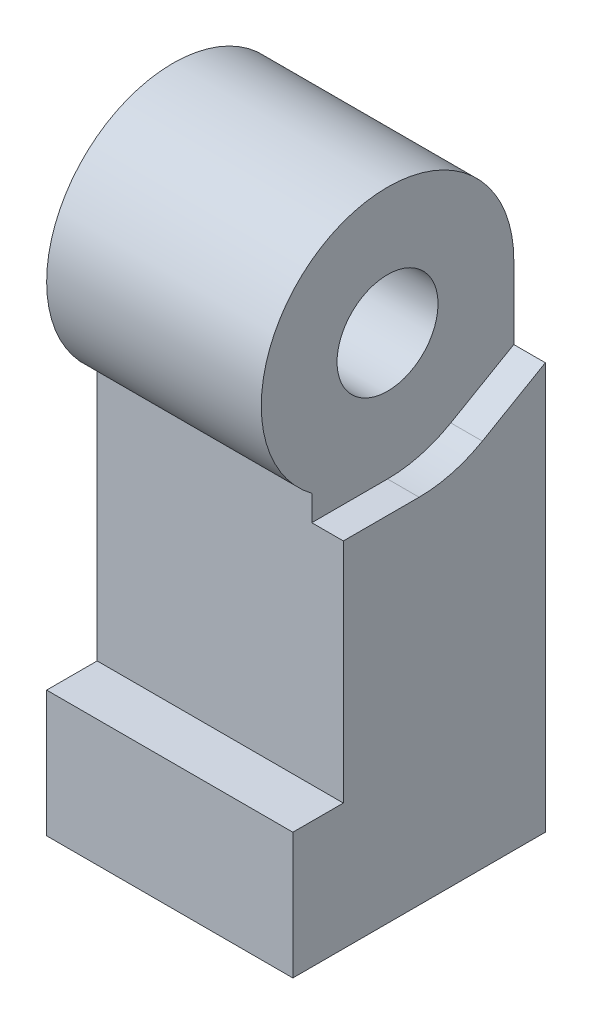
ISO-10303-21;
HEADER;
FILE_DESCRIPTION(('STEP AP214'),'2;1');
FILE_NAME('part.step','',(''),(''),'','','');
FILE_SCHEMA(('AUTOMOTIVE_DESIGN { 1 0 10303 214 1 1 1 1 }'));
ENDSEC;
DATA;
#1=APPLICATION_CONTEXT('core data for automotive mechanical design processes');
#2=APPLICATION_PROTOCOL_DEFINITION('international standard','automotive_design',2000,#1);
#3=PRODUCT_CONTEXT('',#1,'mechanical');
#4=PRODUCT('Part','Part','',(#3));
#5=PRODUCT_RELATED_PRODUCT_CATEGORY('part','',(#4));
#6=PRODUCT_DEFINITION_FORMATION('','',#4);
#7=PRODUCT_DEFINITION_CONTEXT('part definition',#1,'design');
#8=PRODUCT_DEFINITION('design','',#6,#7);
#9=PRODUCT_DEFINITION_SHAPE('','',#8);
#10=(LENGTH_UNIT() NAMED_UNIT(*) SI_UNIT(.MILLI.,.METRE.));
#11=(NAMED_UNIT(*) PLANE_ANGLE_UNIT() SI_UNIT($,.RADIAN.));
#12=(NAMED_UNIT(*) SI_UNIT($,.STERADIAN.) SOLID_ANGLE_UNIT());
#13=UNCERTAINTY_MEASURE_WITH_UNIT(LENGTH_MEASURE(1.E-05),#10,'distance_accuracy_value','');
#14=(GEOMETRIC_REPRESENTATION_CONTEXT(3) GLOBAL_UNCERTAINTY_ASSIGNED_CONTEXT((#13)) GLOBAL_UNIT_ASSIGNED_CONTEXT((#10,
#11,#12)) REPRESENTATION_CONTEXT('',''));
#15=CARTESIAN_POINT('',(0.,0.,0.));
#16=DIRECTION('',(0.,0.,1.));
#17=DIRECTION('',(1.,0.,0.));
#18=AXIS2_PLACEMENT_3D('',#15,#16,#17);
#19=CARTESIAN_POINT('',(43.6847577830937,26.5038495513632,5.52238927686668));
#20=DIRECTION('',(-1.,0.,0.));
#21=DIRECTION('',(0.,0.,1.));
#22=AXIS2_PLACEMENT_3D('',#19,#20,#21);
#23=CYLINDRICAL_SURFACE('',#22,10.);
#24=CARTESIAN_POINT('',(12.4004865356318,26.5038495513632,5.52238927686668));
#25=DIRECTION('',(1.,0.,0.));
#26=DIRECTION('',(0.,0.,-1.));
#27=AXIS2_PLACEMENT_3D('',#24,#25,#26);
#28=CIRCLE('',#27,10.);
#29=CARTESIAN_POINT('',(12.4004865356318,26.5038495513632,-4.47761072313332));
#30=VERTEX_POINT('',#29);
#31=CARTESIAN_POINT('',(12.4004865356318,18.5038495513632,11.5223892768667));
#32=VERTEX_POINT('',#31);
#33=EDGE_CURVE('E44',#30,#32,#28,.T.);
#34=ORIENTED_EDGE('',*,*,#33,.F.);
#35=DIRECTION('',(-1.,0.,0.));
#36=VECTOR('',#35,1.);
#37=CARTESIAN_POINT('',(-4.59951346436824,26.5038495513632,-4.47761072313333));
#38=LINE('',#37,#36);
#39=CARTESIAN_POINT('',(-4.59951346436824,26.5038495513632,-4.47761072313333));
#40=VERTEX_POINT('',#39);
#41=EDGE_CURVE('E187',#30,#40,#38,.T.);
#42=ORIENTED_EDGE('',*,*,#41,.T.);
#43=CARTESIAN_POINT('',(-4.59951346436824,26.5038495513632,5.52238927686668));
#44=DIRECTION('',(1.,0.,0.));
#45=DIRECTION('',(0.,0.,-1.));
#46=AXIS2_PLACEMENT_3D('',#43,#44,#45);
#47=CIRCLE('',#46,10.);
#48=CARTESIAN_POINT('',(-4.59951346436823,18.5038495513632,11.5223892768667));
#49=VERTEX_POINT('',#48);
#50=EDGE_CURVE('E216',#40,#49,#47,.T.);
#51=ORIENTED_EDGE('',*,*,#50,.T.);
#52=DIRECTION('',(-1.,0.,0.));
#53=VECTOR('',#52,1.);
#54=CARTESIAN_POINT('',(43.6847577830937,18.5038495513632,11.5223892768667));
#55=LINE('',#54,#53);
#56=EDGE_CURVE('E208',#49,#32,#55,.F.);
#57=ORIENTED_EDGE('',*,*,#56,.T.);
#58=EDGE_LOOP('',(#34,#42,#51,#57));
#59=FACE_BOUND('',#58,.T.);
#60=ADVANCED_FACE('F36',(#59),#23,.T.);
#61=CARTESIAN_POINT('',(-4.59951346436823,26.5038495513632,11.5223892768667));
#62=DIRECTION('',(0.,0.,-1.));
#63=DIRECTION('',(-1.,0.,0.));
#64=AXIS2_PLACEMENT_3D('',#61,#62,#63);
#65=PLANE('',#64);
#66=DIRECTION('',(1.,0.,0.));
#67=VECTOR('',#66,1.);
#68=CARTESIAN_POINT('',(-4.59951346436823,-1.49615044863682,11.5223892768667));
#69=LINE('',#68,#67);
#70=CARTESIAN_POINT('',(-4.59951346436824,-1.49615044863682,11.5223892768667));
#71=VERTEX_POINT('',#70);
#72=CARTESIAN_POINT('',(14.9004865356318,-1.49615044863682,11.5223892768667));
#73=VERTEX_POINT('',#72);
#74=EDGE_CURVE('E177',#71,#73,#69,.T.);
#75=ORIENTED_EDGE('',*,*,#74,.T.);
#76=DIRECTION('',(0.,1.,0.));
#77=VECTOR('',#76,1.);
#78=CARTESIAN_POINT('',(14.9004865356318,26.5038495513632,11.5223892768667));
#79=LINE('',#78,#77);
#80=CARTESIAN_POINT('',(14.9004865356318,16.4838495513632,11.5223892768667));
#81=VERTEX_POINT('',#80);
#82=EDGE_CURVE('E286',#73,#81,#79,.T.);
#83=ORIENTED_EDGE('',*,*,#82,.T.);
#84=DIRECTION('',(-1.,0.,0.));
#85=VECTOR('',#84,1.);
#86=CARTESIAN_POINT('',(-4.59951346436823,16.4838495513632,11.5223892768667));
#87=LINE('',#86,#85);
#88=CARTESIAN_POINT('',(12.4004865356318,16.4838495513632,11.5223892768667));
#89=VERTEX_POINT('',#88);
#90=EDGE_CURVE('E211',#81,#89,#87,.T.);
#91=ORIENTED_EDGE('',*,*,#90,.T.);
#92=DIRECTION('',(0.,-1.,0.));
#93=VECTOR('',#92,1.);
#94=CARTESIAN_POINT('',(12.4004865356318,26.5038495513632,11.5223892768667));
#95=LINE('',#94,#93);
#96=EDGE_CURVE('E199',#32,#89,#95,.T.);
#97=ORIENTED_EDGE('',*,*,#96,.F.);
#98=ORIENTED_EDGE('',*,*,#56,.F.);
#99=DIRECTION('',(0.,-1.,0.));
#100=VECTOR('',#99,1.);
#101=CARTESIAN_POINT('',(-4.59951346436823,26.5038495513632,11.5223892768667));
#102=LINE('',#101,#100);
#103=EDGE_CURVE('E184',#49,#71,#102,.T.);
#104=ORIENTED_EDGE('',*,*,#103,.T.);
#105=EDGE_LOOP('',(#75,#83,#91,#97,#98,#104));
#106=FACE_BOUND('',#105,.T.);
#107=ADVANCED_FACE('F207',(#106),#65,.F.);
#108=CARTESIAN_POINT('',(-4.59951346436824,-1.49615044863682,-4.47761072313333));
#109=DIRECTION('',(0.,-1.,0.));
#110=DIRECTION('',(0.,0.,-1.));
#111=AXIS2_PLACEMENT_3D('',#108,#109,#110);
#112=PLANE('',#111);
#113=DIRECTION('',(1.,0.,0.));
#114=VECTOR('',#113,1.);
#115=CARTESIAN_POINT('',(-4.59951346436824,-1.49615044863682,15.5223892768667));
#116=LINE('',#115,#114);
#117=CARTESIAN_POINT('',(-4.59951346436824,-1.49615044863682,15.5223892768667));
#118=VERTEX_POINT('',#117);
#119=CARTESIAN_POINT('',(14.9004865356318,-1.49615044863682,15.5223892768667));
#120=VERTEX_POINT('',#119);
#121=EDGE_CURVE('E167',#118,#120,#116,.T.);
#122=ORIENTED_EDGE('',*,*,#121,.T.);
#123=DIRECTION('',(0.,0.,-1.));
#124=VECTOR('',#123,1.);
#125=CARTESIAN_POINT('',(14.9004865356318,-1.49615044863682,-4.47761072313333));
#126=LINE('',#125,#124);
#127=EDGE_CURVE('E145',#120,#73,#126,.T.);
#128=ORIENTED_EDGE('',*,*,#127,.T.);
#129=ORIENTED_EDGE('',*,*,#74,.F.);
#130=DIRECTION('',(0.,0.,1.));
#131=VECTOR('',#130,1.);
#132=CARTESIAN_POINT('',(-4.59951346436824,-1.49615044863682,15.5223892768667));
#133=LINE('',#132,#131);
#134=EDGE_CURVE('E164',#71,#118,#133,.T.);
#135=ORIENTED_EDGE('',*,*,#134,.T.);
#136=EDGE_LOOP('',(#122,#128,#129,#135));
#137=FACE_BOUND('',#136,.T.);
#138=ADVANCED_FACE('F305',(#137),#112,.F.);
#139=CARTESIAN_POINT('',(-4.59951346436824,-1.49615044863682,-4.47761072313333));
#140=DIRECTION('',(0.,0.,1.));
#141=DIRECTION('',(1.,0.,0.));
#142=AXIS2_PLACEMENT_3D('',#139,#140,#141);
#143=PLANE('',#142);
#144=DIRECTION('',(1.,0.,0.));
#145=VECTOR('',#144,1.);
#146=CARTESIAN_POINT('',(12.4004865356318,20.7072528486993,-4.47761072313332));
#147=LINE('',#146,#145);
#148=CARTESIAN_POINT('',(12.4004865356318,20.7072528486993,-4.47761072313332));
#149=VERTEX_POINT('',#148);
#150=CARTESIAN_POINT('',(14.9004865356318,20.7072528486993,-4.47761072313332));
#151=VERTEX_POINT('',#150);
#152=EDGE_CURVE('E230',#149,#151,#147,.T.);
#153=ORIENTED_EDGE('',*,*,#152,.T.);
#154=DIRECTION('',(0.,1.,0.));
#155=VECTOR('',#154,1.);
#156=CARTESIAN_POINT('',(14.9004865356318,-11.4961504486368,-4.47761072313333));
#157=LINE('',#156,#155);
#158=CARTESIAN_POINT('',(14.9004865356318,-11.4961504486368,-4.47761072313333));
#159=VERTEX_POINT('',#158);
#160=EDGE_CURVE('E51',#159,#151,#157,.T.);
#161=ORIENTED_EDGE('',*,*,#160,.F.);
#162=DIRECTION('',(-1.,0.,0.));
#163=VECTOR('',#162,1.);
#164=CARTESIAN_POINT('',(-4.59951346436824,-11.4961504486368,-4.47761072313333));
#165=LINE('',#164,#163);
#166=CARTESIAN_POINT('',(-4.59951346436824,-11.4961504486368,-4.47761072313333));
#167=VERTEX_POINT('',#166);
#168=EDGE_CURVE('E158',#159,#167,#165,.T.);
#169=ORIENTED_EDGE('',*,*,#168,.T.);
#170=DIRECTION('',(0.,-1.,0.));
#171=VECTOR('',#170,1.);
#172=CARTESIAN_POINT('',(-4.59951346436824,-1.49615044863682,-4.47761072313333));
#173=LINE('',#172,#171);
#174=EDGE_CURVE('E173',#40,#167,#173,.T.);
#175=ORIENTED_EDGE('',*,*,#174,.F.);
#176=ORIENTED_EDGE('',*,*,#41,.F.);
#177=DIRECTION('',(0.,1.,0.));
#178=VECTOR('',#177,1.);
#179=CARTESIAN_POINT('',(12.4004865356318,20.7072528486993,-4.47761072313332));
#180=LINE('',#179,#178);
#181=EDGE_CURVE('E203',#149,#30,#180,.T.);
#182=ORIENTED_EDGE('',*,*,#181,.F.);
#183=EDGE_LOOP('',(#153,#161,#169,#175,#176,#182));
#184=FACE_BOUND('',#183,.T.);
#185=ADVANCED_FACE('F38',(#184),#143,.F.);
#186=CARTESIAN_POINT('',(-4.59951346436824,-1.49615044863682,15.5223892768667));
#187=DIRECTION('',(1.,0.,0.));
#188=DIRECTION('',(0.,0.,-1.));
#189=AXIS2_PLACEMENT_3D('',#186,#187,#188);
#190=PLANE('',#189);
#191=CARTESIAN_POINT('',(-4.59951346436824,26.5038495513632,5.52238927686668));
#192=DIRECTION('',(-1.,0.,0.));
#193=DIRECTION('',(0.,0.,1.));
#194=AXIS2_PLACEMENT_3D('',#191,#192,#193);
#195=CIRCLE('',#194,7.);
#196=CARTESIAN_POINT('',(-4.59951346436824,26.5038495513632,12.5223892768667));
#197=VERTEX_POINT('',#196);
#198=EDGE_CURVE('E221',#197,#197,#195,.T.);
#199=ORIENTED_EDGE('',*,*,#198,.F.);
#200=EDGE_LOOP('',(#199));
#201=FACE_BOUND('',#200,.T.);
#202=ORIENTED_EDGE('',*,*,#103,.F.);
#203=ORIENTED_EDGE('',*,*,#50,.F.);
#204=ORIENTED_EDGE('',*,*,#174,.T.);
#205=DIRECTION('',(0.,0.,1.));
#206=VECTOR('',#205,1.);
#207=CARTESIAN_POINT('',(-4.59951346436824,-11.4961504486368,15.5223892768667));
#208=LINE('',#207,#206);
#209=CARTESIAN_POINT('',(-4.59951346436824,-11.4961504486368,15.5223892768667));
#210=VERTEX_POINT('',#209);
#211=EDGE_CURVE('E165',#167,#210,#208,.T.);
#212=ORIENTED_EDGE('',*,*,#211,.T.);
#213=DIRECTION('',(0.,-1.,0.));
#214=VECTOR('',#213,1.);
#215=CARTESIAN_POINT('',(-4.59951346436824,-1.49615044863682,15.5223892768667));
#216=LINE('',#215,#214);
#217=EDGE_CURVE('E163',#118,#210,#216,.T.);
#218=ORIENTED_EDGE('',*,*,#217,.F.);
#219=ORIENTED_EDGE('',*,*,#134,.F.);
#220=EDGE_LOOP('',(#202,#203,#204,#212,#218,#219));
#221=FACE_BOUND('',#220,.T.);
#222=ADVANCED_FACE('F307',(#201,#221),#190,.F.);
#223=CARTESIAN_POINT('',(-4.59951346436824,-1.49615044863682,15.5223892768667));
#224=DIRECTION('',(0.,0.,-1.));
#225=DIRECTION('',(-1.,0.,0.));
#226=AXIS2_PLACEMENT_3D('',#223,#224,#225);
#227=PLANE('',#226);
#228=DIRECTION('',(1.,0.,0.));
#229=VECTOR('',#228,1.);
#230=CARTESIAN_POINT('',(-4.59951346436824,-11.4961504486368,15.5223892768667));
#231=LINE('',#230,#229);
#232=CARTESIAN_POINT('',(14.9004865356318,-11.4961504486368,15.5223892768667));
#233=VERTEX_POINT('',#232);
#234=EDGE_CURVE('E157',#210,#233,#231,.T.);
#235=ORIENTED_EDGE('',*,*,#234,.T.);
#236=DIRECTION('',(0.,-1.,0.));
#237=VECTOR('',#236,1.);
#238=CARTESIAN_POINT('',(14.9004865356318,-11.4961504486368,15.5223892768667));
#239=LINE('',#238,#237);
#240=EDGE_CURVE('E140',#120,#233,#239,.T.);
#241=ORIENTED_EDGE('',*,*,#240,.F.);
#242=ORIENTED_EDGE('',*,*,#121,.F.);
#243=ORIENTED_EDGE('',*,*,#217,.T.);
#244=EDGE_LOOP('',(#235,#241,#242,#243));
#245=FACE_BOUND('',#244,.T.);
#246=ADVANCED_FACE('F161',(#245),#227,.F.);
#247=CARTESIAN_POINT('',(-4.59951346436824,-11.4961504486368,-4.47761072313333));
#248=DIRECTION('',(0.,-1.,0.));
#249=DIRECTION('',(0.,0.,-1.));
#250=AXIS2_PLACEMENT_3D('',#247,#248,#249);
#251=PLANE('',#250);
#252=DIRECTION('',(0.,0.,-1.));
#253=VECTOR('',#252,1.);
#254=CARTESIAN_POINT('',(14.9004865356318,-11.4961504486368,15.5223892768667));
#255=LINE('',#254,#253);
#256=EDGE_CURVE('E143',#233,#159,#255,.T.);
#257=ORIENTED_EDGE('',*,*,#256,.F.);
#258=ORIENTED_EDGE('',*,*,#234,.F.);
#259=ORIENTED_EDGE('',*,*,#211,.F.);
#260=ORIENTED_EDGE('',*,*,#168,.F.);
#261=EDGE_LOOP('',(#257,#258,#259,#260));
#262=FACE_BOUND('',#261,.T.);
#263=DIRECTION('',(0.,0.,-1.));
#264=VECTOR('',#263,1.);
#265=CARTESIAN_POINT('',(-0.599513464368239,-11.4961504486368,-0.477610723133327));
#266=LINE('',#265,#264);
#267=CARTESIAN_POINT('',(-0.599513464368239,-11.4961504486368,11.5223892768667));
#268=VERTEX_POINT('',#267);
#269=CARTESIAN_POINT('',(-0.599513464368239,-11.4961504486368,-0.477610723133327));
#270=VERTEX_POINT('',#269);
#271=EDGE_CURVE('E58',#268,#270,#266,.T.);
#272=ORIENTED_EDGE('',*,*,#271,.F.);
#273=DIRECTION('',(-1.,0.,0.));
#274=VECTOR('',#273,1.);
#275=CARTESIAN_POINT('',(-0.599513464368239,-11.4961504486368,11.5223892768667));
#276=LINE('',#275,#274);
#277=CARTESIAN_POINT('',(11.4004865356318,-11.4961504486368,11.5223892768667));
#278=VERTEX_POINT('',#277);
#279=EDGE_CURVE('E258',#278,#268,#276,.T.);
#280=ORIENTED_EDGE('',*,*,#279,.F.);
#281=DIRECTION('',(0.,0.,1.));
#282=VECTOR('',#281,1.);
#283=CARTESIAN_POINT('',(11.4004865356318,-11.4961504486368,-0.477610723133327));
#284=LINE('',#283,#282);
#285=CARTESIAN_POINT('',(11.4004865356318,-11.4961504486368,-0.477610723133327));
#286=VERTEX_POINT('',#285);
#287=EDGE_CURVE('E262',#286,#278,#284,.T.);
#288=ORIENTED_EDGE('',*,*,#287,.F.);
#289=DIRECTION('',(1.,0.,0.));
#290=VECTOR('',#289,1.);
#291=CARTESIAN_POINT('',(-0.599513464368239,-11.4961504486368,-0.477610723133327));
#292=LINE('',#291,#290);
#293=EDGE_CURVE('E265',#270,#286,#292,.T.);
#294=ORIENTED_EDGE('',*,*,#293,.F.);
#295=EDGE_LOOP('',(#272,#280,#288,#294));
#296=FACE_BOUND('',#295,.T.);
#297=ADVANCED_FACE('F154',(#262,#296),#251,.T.);
#298=CARTESIAN_POINT('',(-4.39951346436824,26.5038495513632,5.52238927686668));
#299=DIRECTION('',(-1.,0.,0.));
#300=DIRECTION('',(0.,0.,1.));
#301=AXIS2_PLACEMENT_3D('',#298,#299,#300);
#302=CYLINDRICAL_SURFACE('',#301,7.);
#303=CARTESIAN_POINT('',(-4.39951346436824,26.5038495513632,5.52238927686668));
#304=DIRECTION('',(-1.,0.,0.));
#305=DIRECTION('',(0.,0.,1.));
#306=AXIS2_PLACEMENT_3D('',#303,#304,#305);
#307=CIRCLE('',#306,7.);
#308=CARTESIAN_POINT('',(-4.39951346436824,26.5038495513632,12.5223892768667));
#309=VERTEX_POINT('',#308);
#310=EDGE_CURVE('E218',#309,#309,#307,.T.);
#311=ORIENTED_EDGE('',*,*,#310,.F.);
#312=EDGE_LOOP('',(#311));
#313=FACE_BOUND('',#312,.T.);
#314=ORIENTED_EDGE('',*,*,#198,.T.);
#315=EDGE_LOOP('',(#314));
#316=FACE_BOUND('',#315,.T.);
#317=ADVANCED_FACE('F322',(#313,#316),#302,.F.);
#318=CARTESIAN_POINT('',(-4.39951346436824,26.5038495513632,5.52238927686668));
#319=DIRECTION('',(-1.,0.,0.));
#320=DIRECTION('',(0.,0.,1.));
#321=AXIS2_PLACEMENT_3D('',#318,#319,#320);
#322=PLANE('',#321);
#323=ORIENTED_EDGE('',*,*,#310,.T.);
#324=EDGE_LOOP('',(#323));
#325=FACE_BOUND('',#324,.T.);
#326=ADVANCED_FACE('F342',(#325),#322,.T.);
#327=CARTESIAN_POINT('',(12.4004865356318,16.4838495513632,5.52238927686668));
#328=DIRECTION('',(0.,-1.,0.));
#329=DIRECTION('',(0.,0.,-1.));
#330=AXIS2_PLACEMENT_3D('',#327,#328,#329);
#331=PLANE('',#330);
#332=ORIENTED_EDGE('',*,*,#90,.F.);
#333=DIRECTION('',(0.,0.,-1.));
#334=VECTOR('',#333,1.);
#335=CARTESIAN_POINT('',(14.9004865356318,16.4838495513632,5.52238927686668));
#336=LINE('',#335,#334);
#337=CARTESIAN_POINT('',(14.9004865356318,16.4838495513632,5.52238927686668));
#338=VERTEX_POINT('',#337);
#339=EDGE_CURVE('E288',#81,#338,#336,.T.);
#340=ORIENTED_EDGE('',*,*,#339,.T.);
#341=DIRECTION('',(1.,0.,0.));
#342=VECTOR('',#341,1.);
#343=CARTESIAN_POINT('',(12.4004865356318,16.4838495513632,5.52238927686668));
#344=LINE('',#343,#342);
#345=CARTESIAN_POINT('',(12.4004865356318,16.4838495513632,5.52238927686668));
#346=VERTEX_POINT('',#345);
#347=EDGE_CURVE('E212',#346,#338,#344,.T.);
#348=ORIENTED_EDGE('',*,*,#347,.F.);
#349=DIRECTION('',(0.,0.,-1.));
#350=VECTOR('',#349,1.);
#351=CARTESIAN_POINT('',(12.4004865356318,16.4838495513632,5.52238927686668));
#352=LINE('',#351,#350);
#353=EDGE_CURVE('E231',#89,#346,#352,.T.);
#354=ORIENTED_EDGE('',*,*,#353,.F.);
#355=EDGE_LOOP('',(#332,#340,#348,#354));
#356=FACE_BOUND('',#355,.T.);
#357=ADVANCED_FACE('F302',(#356),#331,.F.);
#358=CARTESIAN_POINT('',(12.4004865356318,26.5038495513632,5.52238927686668));
#359=DIRECTION('',(1.,0.,0.));
#360=DIRECTION('',(0.,0.,-1.));
#361=AXIS2_PLACEMENT_3D('',#358,#359,#360);
#362=PLANE('',#361);
#363=CARTESIAN_POINT('',(12.4004865356318,26.5038495513632,5.52238927686668));
#364=DIRECTION('',(1.,0.,0.));
#365=DIRECTION('',(0.,0.,-1.));
#366=AXIS2_PLACEMENT_3D('',#363,#364,#365);
#367=CIRCLE('',#366,4.);
#368=CARTESIAN_POINT('',(12.4004865356318,26.5038495513632,1.52238927686668));
#369=VERTEX_POINT('',#368);
#370=EDGE_CURVE('E246',#369,#369,#367,.T.);
#371=ORIENTED_EDGE('',*,*,#370,.F.);
#372=EDGE_LOOP('',(#371));
#373=FACE_BOUND('',#372,.T.);
#374=ORIENTED_EDGE('',*,*,#96,.T.);
#375=ORIENTED_EDGE('',*,*,#353,.T.);
#376=CARTESIAN_POINT('',(12.4004865356318,26.5038495513632,5.52238927686668));
#377=DIRECTION('',(1.,0.,0.));
#378=DIRECTION('',(0.,0.,-1.));
#379=AXIS2_PLACEMENT_3D('',#376,#377,#378);
#380=CIRCLE('',#379,10.02);
#381=CARTESIAN_POINT('',(12.4004865356318,17.8262750054431,0.512389276866663));
#382=VERTEX_POINT('',#381);
#383=EDGE_CURVE('E240',#346,#382,#380,.T.);
#384=ORIENTED_EDGE('',*,*,#383,.T.);
#385=DIRECTION('',(0.,0.500000000000001,-0.866025403784438));
#386=VECTOR('',#385,1.);
#387=CARTESIAN_POINT('',(12.4004865356318,17.8262750054431,0.512389276866663));
#388=LINE('',#387,#386);
#389=EDGE_CURVE('E238',#382,#149,#388,.T.);
#390=ORIENTED_EDGE('',*,*,#389,.T.);
#391=ORIENTED_EDGE('',*,*,#181,.T.);
#392=ORIENTED_EDGE('',*,*,#33,.T.);
#393=EDGE_LOOP('',(#374,#375,#384,#390,#391,#392));
#394=FACE_BOUND('',#393,.T.);
#395=ADVANCED_FACE('F198',(#373,#394),#362,.T.);
#396=CARTESIAN_POINT('',(12.4004865356318,26.5038495513632,5.52238927686668));
#397=DIRECTION('',(1.,0.,0.));
#398=DIRECTION('',(0.,0.,-1.));
#399=AXIS2_PLACEMENT_3D('',#396,#397,#398);
#400=CYLINDRICAL_SURFACE('',#399,10.02);
#401=ORIENTED_EDGE('',*,*,#347,.T.);
#402=CARTESIAN_POINT('',(14.9004865356318,26.5038495513632,5.52238927686668));
#403=DIRECTION('',(-1.,0.,0.));
#404=DIRECTION('',(0.,0.,1.));
#405=AXIS2_PLACEMENT_3D('',#402,#403,#404);
#406=CIRCLE('',#405,10.02);
#407=CARTESIAN_POINT('',(14.9004865356318,17.8262750054431,0.512389276866663));
#408=VERTEX_POINT('',#407);
#409=EDGE_CURVE('E291',#338,#408,#406,.F.);
#410=ORIENTED_EDGE('',*,*,#409,.T.);
#411=DIRECTION('',(1.,0.,0.));
#412=VECTOR('',#411,1.);
#413=CARTESIAN_POINT('',(12.4004865356318,17.8262750054431,0.512389276866663));
#414=LINE('',#413,#412);
#415=EDGE_CURVE('E227',#382,#408,#414,.T.);
#416=ORIENTED_EDGE('',*,*,#415,.F.);
#417=ORIENTED_EDGE('',*,*,#383,.F.);
#418=EDGE_LOOP('',(#401,#410,#416,#417));
#419=FACE_BOUND('',#418,.T.);
#420=ADVANCED_FACE('F295',(#419),#400,.F.);
#421=CARTESIAN_POINT('',(12.4004865356318,17.8262750054431,0.512389276866663));
#422=DIRECTION('',(0.,-0.866025403784438,-0.500000000000001));
#423=DIRECTION('',(0.,0.500000000000001,-0.866025403784438));
#424=AXIS2_PLACEMENT_3D('',#421,#422,#423);
#425=PLANE('',#424);
#426=ORIENTED_EDGE('',*,*,#415,.T.);
#427=DIRECTION('',(0.,0.500000000000001,-0.866025403784438));
#428=VECTOR('',#427,1.);
#429=CARTESIAN_POINT('',(14.9004865356318,17.8262750054431,0.512389276866663));
#430=LINE('',#429,#428);
#431=EDGE_CURVE('E11',#408,#151,#430,.T.);
#432=ORIENTED_EDGE('',*,*,#431,.T.);
#433=ORIENTED_EDGE('',*,*,#152,.F.);
#434=ORIENTED_EDGE('',*,*,#389,.F.);
#435=EDGE_LOOP('',(#426,#432,#433,#434));
#436=FACE_BOUND('',#435,.T.);
#437=ADVANCED_FACE('F300',(#436),#425,.F.);
#438=CARTESIAN_POINT('',(0.400486535631766,26.5038495513632,5.52238927686668));
#439=DIRECTION('',(1.,0.,0.));
#440=DIRECTION('',(0.,0.,-1.));
#441=AXIS2_PLACEMENT_3D('',#438,#439,#440);
#442=CONICAL_SURFACE('',#441,4.,1.02974425867665);
#443=CARTESIAN_POINT('',(-2.00295594047848,26.5038495513632,5.52238927686668));
#444=VERTEX_POINT('',#443);
#445=VERTEX_LOOP('',#444);
#446=FACE_BOUND('',#445,.T.);
#447=CARTESIAN_POINT('',(0.400486535631766,26.5038495513632,5.52238927686668));
#448=DIRECTION('',(1.,0.,0.));
#449=DIRECTION('',(0.,0.,-1.));
#450=AXIS2_PLACEMENT_3D('',#447,#448,#449);
#451=CIRCLE('',#450,4.);
#452=CARTESIAN_POINT('',(0.400486535631766,26.5038495513632,1.52238927686668));
#453=VERTEX_POINT('',#452);
#454=EDGE_CURVE('E243',#453,#453,#451,.T.);
#455=ORIENTED_EDGE('',*,*,#454,.T.);
#456=EDGE_LOOP('',(#455));
#457=FACE_BOUND('',#456,.T.);
#458=ADVANCED_FACE('F374',(#446,#457),#442,.F.);
#459=CARTESIAN_POINT('',(12.4004865356318,26.5038495513632,5.52238927686668));
#460=DIRECTION('',(1.,0.,0.));
#461=DIRECTION('',(0.,0.,-1.));
#462=AXIS2_PLACEMENT_3D('',#459,#460,#461);
#463=CYLINDRICAL_SURFACE('',#462,4.);
#464=ORIENTED_EDGE('',*,*,#454,.F.);
#465=EDGE_LOOP('',(#464));
#466=FACE_BOUND('',#465,.T.);
#467=ORIENTED_EDGE('',*,*,#370,.T.);
#468=EDGE_LOOP('',(#467));
#469=FACE_BOUND('',#468,.T.);
#470=ADVANCED_FACE('F381',(#466,#469),#463,.F.);
#471=CARTESIAN_POINT('',(-0.599513464368239,-6.49615044863682,-0.477610723133327));
#472=DIRECTION('',(-1.,0.,0.));
#473=DIRECTION('',(0.,0.,1.));
#474=AXIS2_PLACEMENT_3D('',#471,#472,#473);
#475=PLANE('',#474);
#476=ORIENTED_EDGE('',*,*,#271,.T.);
#477=DIRECTION('',(0.,-1.,0.));
#478=VECTOR('',#477,1.);
#479=CARTESIAN_POINT('',(-0.599513464368239,-6.49615044863682,-0.477610723133327));
#480=LINE('',#479,#478);
#481=CARTESIAN_POINT('',(-0.599513464368239,-6.49615044863682,-0.477610723133327));
#482=VERTEX_POINT('',#481);
#483=EDGE_CURVE('E250',#482,#270,#480,.T.);
#484=ORIENTED_EDGE('',*,*,#483,.F.);
#485=DIRECTION('',(0.,0.,-1.));
#486=VECTOR('',#485,1.);
#487=CARTESIAN_POINT('',(-0.599513464368239,-6.49615044863682,-0.477610723133327));
#488=LINE('',#487,#486);
#489=CARTESIAN_POINT('',(-0.599513464368239,-6.49615044863682,11.5223892768667));
#490=VERTEX_POINT('',#489);
#491=EDGE_CURVE('E261',#490,#482,#488,.T.);
#492=ORIENTED_EDGE('',*,*,#491,.F.);
#493=DIRECTION('',(0.,-1.,0.));
#494=VECTOR('',#493,1.);
#495=CARTESIAN_POINT('',(-0.599513464368239,-6.49615044863682,11.5223892768667));
#496=LINE('',#495,#494);
#497=EDGE_CURVE('E249',#490,#268,#496,.T.);
#498=ORIENTED_EDGE('',*,*,#497,.T.);
#499=EDGE_LOOP('',(#476,#484,#492,#498));
#500=FACE_BOUND('',#499,.T.);
#501=ADVANCED_FACE('F389',(#500),#475,.F.);
#502=CARTESIAN_POINT('',(-0.599513464368239,-6.49615044863682,11.5223892768667));
#503=DIRECTION('',(0.,0.,1.));
#504=DIRECTION('',(1.,0.,0.));
#505=AXIS2_PLACEMENT_3D('',#502,#503,#504);
#506=PLANE('',#505);
#507=ORIENTED_EDGE('',*,*,#279,.T.);
#508=ORIENTED_EDGE('',*,*,#497,.F.);
#509=DIRECTION('',(-1.,0.,0.));
#510=VECTOR('',#509,1.);
#511=CARTESIAN_POINT('',(-0.599513464368239,-6.49615044863682,11.5223892768667));
#512=LINE('',#511,#510);
#513=CARTESIAN_POINT('',(11.4004865356318,-6.49615044863682,11.5223892768667));
#514=VERTEX_POINT('',#513);
#515=EDGE_CURVE('E253',#514,#490,#512,.T.);
#516=ORIENTED_EDGE('',*,*,#515,.F.);
#517=DIRECTION('',(0.,-1.,0.));
#518=VECTOR('',#517,1.);
#519=CARTESIAN_POINT('',(11.4004865356318,-6.49615044863682,11.5223892768667));
#520=LINE('',#519,#518);
#521=EDGE_CURVE('E255',#514,#278,#520,.T.);
#522=ORIENTED_EDGE('',*,*,#521,.T.);
#523=EDGE_LOOP('',(#507,#508,#516,#522));
#524=FACE_BOUND('',#523,.T.);
#525=ADVANCED_FACE('F397',(#524),#506,.F.);
#526=CARTESIAN_POINT('',(11.4004865356318,-6.49615044863682,-0.477610723133327));
#527=DIRECTION('',(1.,0.,0.));
#528=DIRECTION('',(0.,0.,-1.));
#529=AXIS2_PLACEMENT_3D('',#526,#527,#528);
#530=PLANE('',#529);
#531=ORIENTED_EDGE('',*,*,#287,.T.);
#532=ORIENTED_EDGE('',*,*,#521,.F.);
#533=DIRECTION('',(0.,0.,1.));
#534=VECTOR('',#533,1.);
#535=CARTESIAN_POINT('',(11.4004865356318,-6.49615044863682,-0.477610723133327));
#536=LINE('',#535,#534);
#537=CARTESIAN_POINT('',(11.4004865356318,-6.49615044863682,-0.477610723133327));
#538=VERTEX_POINT('',#537);
#539=EDGE_CURVE('E272',#538,#514,#536,.T.);
#540=ORIENTED_EDGE('',*,*,#539,.F.);
#541=DIRECTION('',(0.,-1.,0.));
#542=VECTOR('',#541,1.);
#543=CARTESIAN_POINT('',(11.4004865356318,-6.49615044863682,-0.477610723133327));
#544=LINE('',#543,#542);
#545=EDGE_CURVE('E252',#538,#286,#544,.T.);
#546=ORIENTED_EDGE('',*,*,#545,.T.);
#547=EDGE_LOOP('',(#531,#532,#540,#546));
#548=FACE_BOUND('',#547,.T.);
#549=ADVANCED_FACE('F404',(#548),#530,.F.);
#550=CARTESIAN_POINT('',(-0.599513464368239,-6.49615044863682,-0.477610723133327));
#551=DIRECTION('',(0.,0.,-1.));
#552=DIRECTION('',(-1.,0.,0.));
#553=AXIS2_PLACEMENT_3D('',#550,#551,#552);
#554=PLANE('',#553);
#555=ORIENTED_EDGE('',*,*,#293,.T.);
#556=ORIENTED_EDGE('',*,*,#545,.F.);
#557=DIRECTION('',(1.,0.,0.));
#558=VECTOR('',#557,1.);
#559=CARTESIAN_POINT('',(-0.599513464368239,-6.49615044863682,-0.477610723133327));
#560=LINE('',#559,#558);
#561=EDGE_CURVE('E275',#482,#538,#560,.T.);
#562=ORIENTED_EDGE('',*,*,#561,.F.);
#563=ORIENTED_EDGE('',*,*,#483,.T.);
#564=EDGE_LOOP('',(#555,#556,#562,#563));
#565=FACE_BOUND('',#564,.T.);
#566=ADVANCED_FACE('F412',(#565),#554,.F.);
#567=CARTESIAN_POINT('',(-4.59951346436824,-6.49615044863682,-4.47761072313333));
#568=DIRECTION('',(0.,1.,0.));
#569=DIRECTION('',(0.,0.,1.));
#570=AXIS2_PLACEMENT_3D('',#567,#568,#569);
#571=PLANE('',#570);
#572=CARTESIAN_POINT('',(5.40048653563176,-6.49615044863682,5.52238927686667));
#573=DIRECTION('',(0.,-1.,0.));
#574=DIRECTION('',(0.,0.,-1.));
#575=AXIS2_PLACEMENT_3D('',#572,#573,#574);
#576=CIRCLE('',#575,3.);
#577=CARTESIAN_POINT('',(5.40048653563176,-6.49615044863682,2.52238927686668));
#578=VERTEX_POINT('',#577);
#579=EDGE_CURVE('E282',#578,#578,#576,.T.);
#580=ORIENTED_EDGE('',*,*,#579,.F.);
#581=EDGE_LOOP('',(#580));
#582=FACE_BOUND('',#581,.T.);
#583=ORIENTED_EDGE('',*,*,#491,.T.);
#584=ORIENTED_EDGE('',*,*,#561,.T.);
#585=ORIENTED_EDGE('',*,*,#539,.T.);
#586=ORIENTED_EDGE('',*,*,#515,.T.);
#587=EDGE_LOOP('',(#583,#584,#585,#586));
#588=FACE_BOUND('',#587,.T.);
#589=ADVANCED_FACE('F420',(#582,#588),#571,.F.);
#590=CARTESIAN_POINT('',(5.40048653563176,9.50384955136319,5.52238927686667));
#591=DIRECTION('',(0.,-1.,0.));
#592=DIRECTION('',(0.,0.,-1.));
#593=AXIS2_PLACEMENT_3D('',#590,#591,#592);
#594=CONICAL_SURFACE('',#593,3.,1.02974425867665);
#595=CARTESIAN_POINT('',(5.40048653563176,11.3064314084459,5.52238927686667));
#596=VERTEX_POINT('',#595);
#597=VERTEX_LOOP('',#596);
#598=FACE_BOUND('',#597,.T.);
#599=CARTESIAN_POINT('',(5.40048653563176,9.50384955136319,5.52238927686667));
#600=DIRECTION('',(0.,-1.,0.));
#601=DIRECTION('',(0.,0.,-1.));
#602=AXIS2_PLACEMENT_3D('',#599,#600,#601);
#603=CIRCLE('',#602,3.);
#604=CARTESIAN_POINT('',(5.40048653563176,9.50384955136319,2.52238927686668));
#605=VERTEX_POINT('',#604);
#606=EDGE_CURVE('E269',#605,#605,#603,.T.);
#607=ORIENTED_EDGE('',*,*,#606,.T.);
#608=EDGE_LOOP('',(#607));
#609=FACE_BOUND('',#608,.T.);
#610=ADVANCED_FACE('F428',(#598,#609),#594,.F.);
#611=CARTESIAN_POINT('',(5.40048653563176,-6.49615044863682,5.52238927686667));
#612=DIRECTION('',(0.,-1.,0.));
#613=DIRECTION('',(0.,0.,-1.));
#614=AXIS2_PLACEMENT_3D('',#611,#612,#613);
#615=CYLINDRICAL_SURFACE('',#614,3.);
#616=ORIENTED_EDGE('',*,*,#606,.F.);
#617=EDGE_LOOP('',(#616));
#618=FACE_BOUND('',#617,.T.);
#619=ORIENTED_EDGE('',*,*,#579,.T.);
#620=EDGE_LOOP('',(#619));
#621=FACE_BOUND('',#620,.T.);
#622=ADVANCED_FACE('F436',(#618,#621),#615,.F.);
#623=CARTESIAN_POINT('',(14.9004865356318,-11.4961504486368,-4.47761072313333));
#624=DIRECTION('',(-1.,0.,0.));
#625=DIRECTION('',(0.,0.,1.));
#626=AXIS2_PLACEMENT_3D('',#623,#624,#625);
#627=PLANE('',#626);
#628=ORIENTED_EDGE('',*,*,#240,.T.);
#629=ORIENTED_EDGE('',*,*,#256,.T.);
#630=ORIENTED_EDGE('',*,*,#160,.T.);
#631=ORIENTED_EDGE('',*,*,#431,.F.);
#632=ORIENTED_EDGE('',*,*,#409,.F.);
#633=ORIENTED_EDGE('',*,*,#339,.F.);
#634=ORIENTED_EDGE('',*,*,#82,.F.);
#635=ORIENTED_EDGE('',*,*,#127,.F.);
#636=EDGE_LOOP('',(#628,#629,#630,#631,#632,#633,#634,#635));
#637=FACE_BOUND('',#636,.T.);
#638=ADVANCED_FACE('F142',(#637),#627,.F.);
#639=CLOSED_SHELL('',(#60,#107,#138,#185,#222,#246,#297,#317,#326,#357,#395,#420,#437,#458,#470,
#501,#525,#549,#566,#589,#610,#622,#638));
#640=MANIFOLD_SOLID_BREP('B2',#639);
#641=ADVANCED_BREP_SHAPE_REPRESENTATION('',(#18,#640),#14);
#642=SHAPE_DEFINITION_REPRESENTATION(#9,#641);
ENDSEC;
END-ISO-10303-21;
